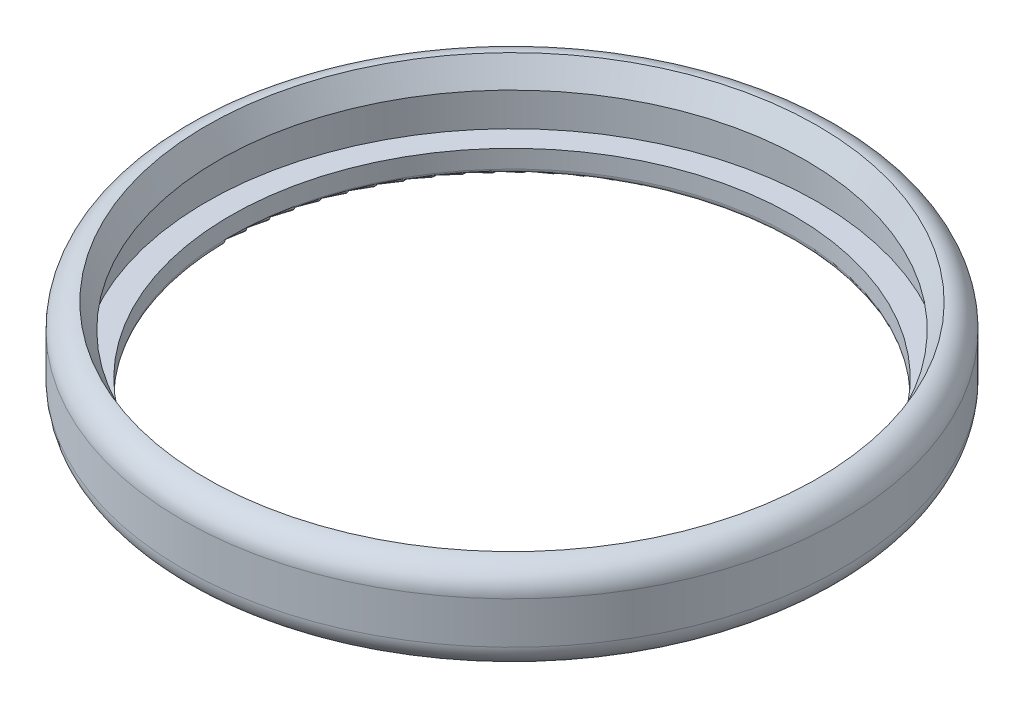
ISO-10303-21;
HEADER;
FILE_DESCRIPTION(('STEP AP214'),'2;1');
FILE_NAME('part.step','',(''),(''),'','','');
FILE_SCHEMA(('AUTOMOTIVE_DESIGN { 1 0 10303 214 1 1 1 1 }'));
ENDSEC;
DATA;
#1=APPLICATION_CONTEXT('core data for automotive mechanical design processes');
#2=APPLICATION_PROTOCOL_DEFINITION('international standard','automotive_design',2000,#1);
#3=PRODUCT_CONTEXT('',#1,'mechanical');
#4=PRODUCT('Part','Part','',(#3));
#5=PRODUCT_RELATED_PRODUCT_CATEGORY('part','',(#4));
#6=PRODUCT_DEFINITION_FORMATION('','',#4);
#7=PRODUCT_DEFINITION_CONTEXT('part definition',#1,'design');
#8=PRODUCT_DEFINITION('design','',#6,#7);
#9=PRODUCT_DEFINITION_SHAPE('','',#8);
#10=(LENGTH_UNIT() NAMED_UNIT(*) SI_UNIT(.MILLI.,.METRE.));
#11=(NAMED_UNIT(*) PLANE_ANGLE_UNIT() SI_UNIT($,.RADIAN.));
#12=(NAMED_UNIT(*) SI_UNIT($,.STERADIAN.) SOLID_ANGLE_UNIT());
#13=UNCERTAINTY_MEASURE_WITH_UNIT(LENGTH_MEASURE(1.E-05),#10,'distance_accuracy_value','');
#14=(GEOMETRIC_REPRESENTATION_CONTEXT(3) GLOBAL_UNCERTAINTY_ASSIGNED_CONTEXT((#13)) GLOBAL_UNIT_ASSIGNED_CONTEXT((#10,
#11,#12)) REPRESENTATION_CONTEXT('',''));
#15=CARTESIAN_POINT('',(0.,0.,0.));
#16=DIRECTION('',(0.,0.,1.));
#17=DIRECTION('',(1.,0.,0.));
#18=AXIS2_PLACEMENT_3D('',#15,#16,#17);
#19=CARTESIAN_POINT('',(23.5,-2.,0.));
#20=DIRECTION('',(0.,-1.,0.));
#21=DIRECTION('',(0.,0.,-1.));
#22=AXIS2_PLACEMENT_3D('',#19,#20,#21);
#23=PLANE('',#22);
#24=CARTESIAN_POINT('',(0.,-2.,0.));
#25=DIRECTION('',(0.,-1.,0.));
#26=DIRECTION('',(0.,0.,-1.));
#27=AXIS2_PLACEMENT_3D('',#24,#25,#26);
#28=CIRCLE('',#27,24.);
#29=CARTESIAN_POINT('',(0.,-2.,-24.));
#30=VERTEX_POINT('',#29);
#31=EDGE_CURVE('E10',#30,#30,#28,.F.);
#32=ORIENTED_EDGE('',*,*,#31,.T.);
#33=EDGE_LOOP('',(#32));
#34=FACE_BOUND('',#33,.T.);
#35=CARTESIAN_POINT('',(0.,-2.,0.));
#36=DIRECTION('',(0.,-1.,0.));
#37=DIRECTION('',(0.,0.,-1.));
#38=AXIS2_PLACEMENT_3D('',#35,#36,#37);
#39=CIRCLE('',#38,25.5);
#40=CARTESIAN_POINT('',(0.,-2.,-25.5));
#41=VERTEX_POINT('',#40);
#42=EDGE_CURVE('E50',#41,#41,#39,.T.);
#43=ORIENTED_EDGE('',*,*,#42,.T.);
#44=EDGE_LOOP('',(#43));
#45=FACE_BOUND('',#44,.T.);
#46=ADVANCED_FACE('F37',(#34,#45),#23,.T.);
#47=CARTESIAN_POINT('',(0.,0.,0.));
#48=DIRECTION('',(0.,-1.,0.));
#49=DIRECTION('',(0.,0.,-1.));
#50=AXIS2_PLACEMENT_3D('',#47,#48,#49);
#51=CYLINDRICAL_SURFACE('',#50,27.5);
#52=CARTESIAN_POINT('',(0.,3.5,0.));
#53=DIRECTION('',(0.,1.,0.));
#54=DIRECTION('',(0.,0.,1.));
#55=AXIS2_PLACEMENT_3D('',#52,#53,#54);
#56=CIRCLE('',#55,27.5);
#57=CARTESIAN_POINT('',(0.,3.5,27.5));
#58=VERTEX_POINT('',#57);
#59=EDGE_CURVE('E55',#58,#58,#56,.F.);
#60=ORIENTED_EDGE('',*,*,#59,.T.);
#61=EDGE_LOOP('',(#60));
#62=FACE_BOUND('',#61,.T.);
#63=CARTESIAN_POINT('',(0.,0.,0.));
#64=DIRECTION('',(0.,-1.,0.));
#65=DIRECTION('',(0.,0.,-1.));
#66=AXIS2_PLACEMENT_3D('',#63,#64,#65);
#67=CIRCLE('',#66,27.5);
#68=CARTESIAN_POINT('',(0.,0.,-27.5));
#69=VERTEX_POINT('',#68);
#70=EDGE_CURVE('E61',#69,#69,#67,.F.);
#71=ORIENTED_EDGE('',*,*,#70,.T.);
#72=EDGE_LOOP('',(#71));
#73=FACE_BOUND('',#72,.T.);
#74=ADVANCED_FACE('F103',(#62,#73),#51,.T.);
#75=CARTESIAN_POINT('',(0.,5.5,0.));
#76=DIRECTION('',(0.,1.,0.));
#77=DIRECTION('',(0.,0.,1.));
#78=AXIS2_PLACEMENT_3D('',#75,#76,#77);
#79=CONICAL_SURFACE('',#78,25.5,0.463647609000808);
#80=CARTESIAN_POINT('',(0.,3.5,0.));
#81=DIRECTION('',(0.,-1.,0.));
#82=DIRECTION('',(0.,0.,-1.));
#83=AXIS2_PLACEMENT_3D('',#80,#81,#82);
#84=CIRCLE('',#83,24.5);
#85=CARTESIAN_POINT('',(0.,3.5,-24.5));
#86=VERTEX_POINT('',#85);
#87=EDGE_CURVE('E69',#86,#86,#84,.T.);
#88=ORIENTED_EDGE('',*,*,#87,.T.);
#89=EDGE_LOOP('',(#88));
#90=FACE_BOUND('',#89,.T.);
#91=CARTESIAN_POINT('',(0.,5.5,0.));
#92=DIRECTION('',(0.,-1.,0.));
#93=DIRECTION('',(0.,0.,-1.));
#94=AXIS2_PLACEMENT_3D('',#91,#92,#93);
#95=CIRCLE('',#94,25.5);
#96=CARTESIAN_POINT('',(0.,5.5,-25.5));
#97=VERTEX_POINT('',#96);
#98=EDGE_CURVE('E65',#97,#97,#95,.T.);
#99=ORIENTED_EDGE('',*,*,#98,.F.);
#100=EDGE_LOOP('',(#99));
#101=FACE_BOUND('',#100,.T.);
#102=ADVANCED_FACE('F108',(#90,#101),#79,.F.);
#103=CARTESIAN_POINT('',(24.5,3.5,0.));
#104=DIRECTION('',(0.,-1.,0.));
#105=DIRECTION('',(0.,0.,-1.));
#106=AXIS2_PLACEMENT_3D('',#103,#104,#105);
#107=PLANE('',#106);
#108=CARTESIAN_POINT('',(0.,3.5,0.));
#109=DIRECTION('',(0.,-1.,0.));
#110=DIRECTION('',(0.,0.,-1.));
#111=AXIS2_PLACEMENT_3D('',#108,#109,#110);
#112=CIRCLE('',#111,25.5);
#113=CARTESIAN_POINT('',(0.,3.5,-25.5));
#114=VERTEX_POINT('',#113);
#115=EDGE_CURVE('E73',#114,#114,#112,.T.);
#116=ORIENTED_EDGE('',*,*,#115,.T.);
#117=EDGE_LOOP('',(#116));
#118=FACE_BOUND('',#117,.T.);
#119=ORIENTED_EDGE('',*,*,#87,.F.);
#120=EDGE_LOOP('',(#119));
#121=FACE_BOUND('',#120,.T.);
#122=ADVANCED_FACE('F167',(#118,#121),#107,.T.);
#123=CARTESIAN_POINT('',(0.,0.,0.));
#124=DIRECTION('',(0.,-1.,0.));
#125=DIRECTION('',(0.,0.,-1.));
#126=AXIS2_PLACEMENT_3D('',#123,#124,#125);
#127=CYLINDRICAL_SURFACE('',#126,25.5);
#128=CARTESIAN_POINT('',(0.,0.,0.));
#129=DIRECTION('',(0.,-1.,0.));
#130=DIRECTION('',(0.,0.,-1.));
#131=AXIS2_PLACEMENT_3D('',#128,#129,#130);
#132=CIRCLE('',#131,25.5);
#133=CARTESIAN_POINT('',(0.,0.,-25.5));
#134=VERTEX_POINT('',#133);
#135=EDGE_CURVE('E77',#134,#134,#132,.T.);
#136=ORIENTED_EDGE('',*,*,#135,.T.);
#137=EDGE_LOOP('',(#136));
#138=FACE_BOUND('',#137,.T.);
#139=ORIENTED_EDGE('',*,*,#115,.F.);
#140=EDGE_LOOP('',(#139));
#141=FACE_BOUND('',#140,.T.);
#142=ADVANCED_FACE('F100',(#138,#141),#127,.F.);
#143=CARTESIAN_POINT('',(25.5,0.,0.));
#144=DIRECTION('',(0.,1.,0.));
#145=DIRECTION('',(0.,0.,1.));
#146=AXIS2_PLACEMENT_3D('',#143,#144,#145);
#147=PLANE('',#146);
#148=CARTESIAN_POINT('',(0.,0.,0.));
#149=DIRECTION('',(0.,-1.,0.));
#150=DIRECTION('',(0.,0.,-1.));
#151=AXIS2_PLACEMENT_3D('',#148,#149,#150);
#152=CIRCLE('',#151,23.5);
#153=CARTESIAN_POINT('',(0.,0.,-23.5));
#154=VERTEX_POINT('',#153);
#155=EDGE_CURVE('E81',#154,#154,#152,.T.);
#156=ORIENTED_EDGE('',*,*,#155,.T.);
#157=EDGE_LOOP('',(#156));
#158=FACE_BOUND('',#157,.T.);
#159=ORIENTED_EDGE('',*,*,#135,.F.);
#160=EDGE_LOOP('',(#159));
#161=FACE_BOUND('',#160,.T.);
#162=ADVANCED_FACE('F86',(#158,#161),#147,.T.);
#163=CARTESIAN_POINT('',(0.,0.,0.));
#164=DIRECTION('',(0.,-1.,0.));
#165=DIRECTION('',(0.,0.,-1.));
#166=AXIS2_PLACEMENT_3D('',#163,#164,#165);
#167=CYLINDRICAL_SURFACE('',#166,23.5);
#168=CARTESIAN_POINT('',(0.,-1.5,0.));
#169=DIRECTION('',(0.,-1.,0.));
#170=DIRECTION('',(0.,0.,-1.));
#171=AXIS2_PLACEMENT_3D('',#168,#169,#170);
#172=CIRCLE('',#171,23.5);
#173=CARTESIAN_POINT('',(0.,-1.5,-23.5));
#174=VERTEX_POINT('',#173);
#175=EDGE_CURVE('E45',#174,#174,#172,.T.);
#176=ORIENTED_EDGE('',*,*,#175,.T.);
#177=EDGE_LOOP('',(#176));
#178=FACE_BOUND('',#177,.T.);
#179=ORIENTED_EDGE('',*,*,#155,.F.);
#180=EDGE_LOOP('',(#179));
#181=FACE_BOUND('',#180,.T.);
#182=ADVANCED_FACE('F89',(#178,#181),#167,.F.);
#183=CARTESIAN_POINT('',(0.,3.5,0.));
#184=DIRECTION('',(0.,1.,0.));
#185=DIRECTION('',(0.,0.,1.));
#186=AXIS2_PLACEMENT_3D('',#183,#184,#185);
#187=TOROIDAL_SURFACE('',#186,25.5,2.);
#188=ORIENTED_EDGE('',*,*,#98,.T.);
#189=EDGE_LOOP('',(#188));
#190=FACE_BOUND('',#189,.T.);
#191=ORIENTED_EDGE('',*,*,#59,.F.);
#192=EDGE_LOOP('',(#191));
#193=FACE_BOUND('',#192,.T.);
#194=ADVANCED_FACE('F91',(#190,#193),#187,.T.);
#195=CARTESIAN_POINT('',(0.,0.,0.));
#196=DIRECTION('',(0.,-1.,0.));
#197=DIRECTION('',(0.,0.,-1.));
#198=AXIS2_PLACEMENT_3D('',#195,#196,#197);
#199=TOROIDAL_SURFACE('',#198,25.5,2.);
#200=ORIENTED_EDGE('',*,*,#70,.F.);
#201=EDGE_LOOP('',(#200));
#202=FACE_BOUND('',#201,.T.);
#203=ORIENTED_EDGE('',*,*,#42,.F.);
#204=EDGE_LOOP('',(#203));
#205=FACE_BOUND('',#204,.T.);
#206=ADVANCED_FACE('F97',(#202,#205),#199,.T.);
#207=CARTESIAN_POINT('',(0.,-1.5,0.));
#208=DIRECTION('',(0.,-1.,0.));
#209=DIRECTION('',(0.,0.,-1.));
#210=AXIS2_PLACEMENT_3D('',#207,#208,#209);
#211=TOROIDAL_SURFACE('',#210,24.,0.5);
#212=ORIENTED_EDGE('',*,*,#31,.F.);
#213=EDGE_LOOP('',(#212));
#214=FACE_BOUND('',#213,.T.);
#215=ORIENTED_EDGE('',*,*,#175,.F.);
#216=EDGE_LOOP('',(#215));
#217=FACE_BOUND('',#216,.T.);
#218=ADVANCED_FACE('F39',(#214,#217),#211,.T.);
#219=CLOSED_SHELL('',(#46,#74,#102,#122,#142,#162,#182,#194,#206,#218));
#220=MANIFOLD_SOLID_BREP('B2',#219);
#221=ADVANCED_BREP_SHAPE_REPRESENTATION('',(#18,#220),#14);
#222=SHAPE_DEFINITION_REPRESENTATION(#9,#221);
ENDSEC;
END-ISO-10303-21;
